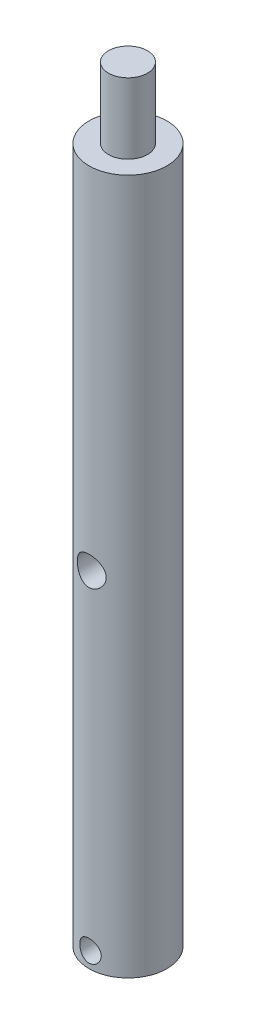
ISO-10303-21;
HEADER;
FILE_DESCRIPTION(('STEP AP214'),'2;1');
FILE_NAME('part.step','',(''),(''),'','','');
FILE_SCHEMA(('AUTOMOTIVE_DESIGN { 1 0 10303 214 1 1 1 1 }'));
ENDSEC;
DATA;
#1=APPLICATION_CONTEXT('core data for automotive mechanical design processes');
#2=APPLICATION_PROTOCOL_DEFINITION('international standard','automotive_design',2000,#1);
#3=PRODUCT_CONTEXT('',#1,'mechanical');
#4=PRODUCT('Part','Part','',(#3));
#5=PRODUCT_RELATED_PRODUCT_CATEGORY('part','',(#4));
#6=PRODUCT_DEFINITION_FORMATION('','',#4);
#7=PRODUCT_DEFINITION_CONTEXT('part definition',#1,'design');
#8=PRODUCT_DEFINITION('design','',#6,#7);
#9=PRODUCT_DEFINITION_SHAPE('','',#8);
#10=(LENGTH_UNIT() NAMED_UNIT(*) SI_UNIT(.MILLI.,.METRE.));
#11=(NAMED_UNIT(*) PLANE_ANGLE_UNIT() SI_UNIT($,.RADIAN.));
#12=(NAMED_UNIT(*) SI_UNIT($,.STERADIAN.) SOLID_ANGLE_UNIT());
#13=UNCERTAINTY_MEASURE_WITH_UNIT(LENGTH_MEASURE(1.E-05),#10,'distance_accuracy_value','');
#14=(GEOMETRIC_REPRESENTATION_CONTEXT(3) GLOBAL_UNCERTAINTY_ASSIGNED_CONTEXT((#13)) GLOBAL_UNIT_ASSIGNED_CONTEXT((#10,
#11,#12)) REPRESENTATION_CONTEXT('',''));
#15=CARTESIAN_POINT('',(0.,0.,0.));
#16=DIRECTION('',(0.,0.,1.));
#17=DIRECTION('',(1.,0.,0.));
#18=AXIS2_PLACEMENT_3D('',#15,#16,#17);
#19=CARTESIAN_POINT('',(0.,62.3951,0.));
#20=DIRECTION('',(0.,-1.,0.));
#21=DIRECTION('',(0.,0.,-1.));
#22=AXIS2_PLACEMENT_3D('',#19,#20,#21);
#23=CYLINDRICAL_SURFACE('',#22,6.35);
#24=CARTESIAN_POINT('',(0.,-3.89889999999999,-6.35));
#25=CARTESIAN_POINT('',(-0.127360787663598,-3.89889601703984,-6.35000295417938));
#26=CARTESIAN_POINT('',(-0.254693941260526,-3.90928844752814,-6.34613472077242));
#27=CARTESIAN_POINT('',(-0.505561435740975,-3.95042057182543,-6.33108941400565));
#28=CARTESIAN_POINT('',(-0.629096210144684,-3.9811579345192,-6.31991317799599));
#29=CARTESIAN_POINT('',(-0.868713197022827,-4.06174848789353,-6.29145339974386));
#30=CARTESIAN_POINT('',(-0.9848090651335,-4.11156540800036,-6.27418145042084));
#31=CARTESIAN_POINT('',(-1.20698916570876,-4.22871904163339,-6.2352558081497));
#32=CARTESIAN_POINT('',(-1.31307078013658,-4.29606031938014,-6.21360097400585));
#33=CARTESIAN_POINT('',(-1.51661477098559,-4.44927295080525,-6.16714597528546));
#34=CARTESIAN_POINT('',(-1.61360606143278,-4.53574341515809,-6.14225843360142));
#35=CARTESIAN_POINT('',(-1.79208769058705,-4.72348788728222,-6.09257912470365));
#36=CARTESIAN_POINT('',(-1.87357346545142,-4.8247662380947,-6.06778738778585));
#37=CARTESIAN_POINT('',(-2.02168724999719,-5.04380864433671,-6.02009716514052));
#38=CARTESIAN_POINT('',(-2.08765652139002,-5.16204291977699,-5.99730221410429));
#39=CARTESIAN_POINT('',(-2.19856499710894,-5.40890503293765,-5.95754220542621));
#40=CARTESIAN_POINT('',(-2.24351234810763,-5.53752882168687,-5.94057489006574));
#41=CARTESIAN_POINT('',(-2.30925278788329,-5.7961027739158,-5.91532366779428));
#42=CARTESIAN_POINT('',(-2.33094307399739,-5.92579241850637,-5.90671852366877));
#43=CARTESIAN_POINT('',(-2.35235907148794,-6.18723417693477,-5.89822455130618));
#44=CARTESIAN_POINT('',(-2.3520935482168,-6.3189854467131,-5.89833224466856));
#45=CARTESIAN_POINT('',(-2.33029282375646,-6.57267523647395,-5.90697422527143));
#46=CARTESIAN_POINT('',(-2.30999246723068,-6.69473960499904,-5.91501928491782));
#47=CARTESIAN_POINT('',(-2.2507363392273,-6.93358757347164,-5.93781804591648));
#48=CARTESIAN_POINT('',(-2.21177783389193,-7.05037039680324,-5.95257273037065));
#49=CARTESIAN_POINT('',(-2.11561737832595,-7.27789270210022,-5.98742940434679));
#50=CARTESIAN_POINT('',(-2.05808957635087,-7.38847937464579,-6.00762574971351));
#51=CARTESIAN_POINT('',(-1.92665049793876,-7.59879197586857,-6.05105769974177));
#52=CARTESIAN_POINT('',(-1.85273367192697,-7.69851420858088,-6.07429433279627));
#53=CARTESIAN_POINT('',(-1.68493032608606,-7.89111605256868,-6.12303988290107));
#54=CARTESIAN_POINT('',(-1.59005508572321,-7.98312383265699,-6.14859810531069));
#55=CARTESIAN_POINT('',(-1.38592433613824,-8.1501782615336,-6.19780001224358));
#56=CARTESIAN_POINT('',(-1.27666673601941,-8.22522243984757,-6.22144341758337));
#57=CARTESIAN_POINT('',(-1.04469636813253,-8.35714702327136,-6.26459981895838));
#58=CARTESIAN_POINT('',(-0.921809444786996,-8.41374425614779,-6.28404700108022));
#59=CARTESIAN_POINT('',(-0.667360573641363,-8.50517510779832,-6.31613310426047));
#60=CARTESIAN_POINT('',(-0.535802399742019,-8.54001812619151,-6.3287749654543));
#61=CARTESIAN_POINT('',(-0.27508842804644,-8.58529205082297,-6.34531292709005));
#62=CARTESIAN_POINT('',(-0.146163048250318,-8.59689744905127,-6.34962936529853));
#63=CARTESIAN_POINT('',(0.111849905262775,-8.59877726855824,-6.35032428081513));
#64=CARTESIAN_POINT('',(0.24093743819339,-8.58905627105882,-6.3467044629473));
#65=CARTESIAN_POINT('',(0.490582282231385,-8.54945698968406,-6.33221109212088));
#66=CARTESIAN_POINT('',(0.611278281932677,-8.5203419929561,-6.32161238151576));
#67=CARTESIAN_POINT('',(0.845992162467297,-8.44377978341044,-6.29450282311486));
#68=CARTESIAN_POINT('',(0.960009172099153,-8.39633018514847,-6.2779912060341));
#69=CARTESIAN_POINT('',(1.18184134520267,-8.28294400029316,-6.2400952028137));
#70=CARTESIAN_POINT('',(1.28937976088916,-8.21650996214139,-6.21858308562928));
#71=CARTESIAN_POINT('',(1.49213823360542,-8.06760553231921,-6.1730736905879));
#72=CARTESIAN_POINT('',(1.58735380909957,-7.98512933362177,-6.1490755142887));
#73=CARTESIAN_POINT('',(1.76838271101855,-7.80099934466734,-6.09955950207343));
#74=CARTESIAN_POINT('',(1.8533618340029,-7.6985257824198,-6.07403235592693));
#75=CARTESIAN_POINT('',(2.00507499925186,-7.48026344268712,-6.0256562849972));
#76=CARTESIAN_POINT('',(2.0718076306718,-7.36447363655387,-6.00280756739185));
#77=CARTESIAN_POINT('',(2.18514302312719,-7.1220429893022,-5.96249106238621));
#78=CARTESIAN_POINT('',(2.23168037366417,-6.99536845736189,-5.94504081170687));
#79=CARTESIAN_POINT('',(2.30246994587984,-6.73515837937945,-5.91798919101977));
#80=CARTESIAN_POINT('',(2.32673545884374,-6.60162697566195,-5.90838314016448));
#81=CARTESIAN_POINT('',(2.35112204023037,-6.34050565844945,-5.89871856501635));
#82=CARTESIAN_POINT('',(2.35266074729382,-6.21306774292601,-5.89809950047377));
#83=CARTESIAN_POINT('',(2.3351641751857,-5.95985188274213,-5.90504827867757));
#84=CARTESIAN_POINT('',(2.31613074185206,-5.83407379017873,-5.91261538691861));
#85=CARTESIAN_POINT('',(2.25912250259281,-5.59143195327047,-5.93462310046297));
#86=CARTESIAN_POINT('',(2.22171132439475,-5.4744156087386,-5.94885862296769));
#87=CARTESIAN_POINT('',(2.12950043137272,-5.24824875353715,-5.98248481595111));
#88=CARTESIAN_POINT('',(2.0746963773417,-5.13910021408985,-6.00187677267067));
#89=CARTESIAN_POINT('',(1.94598392572873,-4.92566977861112,-6.04487133798742));
#90=CARTESIAN_POINT('',(1.87123831892642,-4.82192643721682,-6.06863914725568));
#91=CARTESIAN_POINT('',(1.70607508258558,-4.62800142346976,-6.11712421917554));
#92=CARTESIAN_POINT('',(1.61565253996359,-4.53782401921956,-6.14184177757847));
#93=CARTESIAN_POINT('',(1.41606630307115,-4.36880538330508,-6.19098863347117));
#94=CARTESIAN_POINT('',(1.30617150973204,-4.29079983155387,-6.21533577935108));
#95=CARTESIAN_POINT('',(1.07398179449799,-4.15439909624378,-6.25963397000797));
#96=CARTESIAN_POINT('',(0.951686462040025,-4.0960045622521,-6.27958486916247));
#97=CARTESIAN_POINT('',(0.693940407512734,-3.99937166649362,-6.31334676608802));
#98=CARTESIAN_POINT('',(0.558193201156075,-3.96184143836239,-6.32693982045106));
#99=CARTESIAN_POINT('',(0.281617801168145,-3.9116136144786,-6.34526273164004));
#100=CARTESIAN_POINT('',(0.140792015649353,-3.8989044029956,-6.34999673427844));
#101=CARTESIAN_POINT('',(0.,-3.89889999999999,-6.35));
#102=B_SPLINE_CURVE_WITH_KNOTS('',3,(#24,#25,#26,#27,#28,#29,#30,#31,#32,#33,#34,#35,#36,#37,
#38,#39,#40,#41,#42,#43,#44,#45,#46,#47,#48,#49,#50,#51,#52,#53,#54,#55,#56,#57,#58,#59,#60,#61,
#62,#63,#64,#65,#66,#67,#68,#69,#70,#71,#72,#73,#74,#75,#76,#77,#78,#79,#80,#81,#82,#83,#84,#85,
#86,#87,#88,#89,#90,#91,#92,#93,#94,#95,#96,#97,#98,#99,#100,#101),.UNSPECIFIED.,.T.,.F.,(4,2,2,
2,2,2,2,2,2,2,2,2,2,2,2,2,2,2,2,2,2,2,2,2,2,2,2,2,2,2,2,2,2,2,2,2,2,2,4),(0.,0.381563194853741,
0.763082677896513,1.14388045704999,1.52477751445499,1.91992803023799,2.31519467403099,
2.72503784820589,3.13472206305114,3.52796025133525,3.92104144906659,4.29131821427317,
4.661649250344,5.03886848236164,5.4162156421982,5.8181994577924,6.22024177816762,
6.62819310361556,7.03596803815578,7.42255284392505,7.80905461375194,8.18117881780923,
8.55335145382225,8.93634629078968,9.31948002515868,9.72424227272188,10.1290358082327,
10.5351308179996,10.9409833223737,11.3214047080911,11.7017919632843,12.071179855639,
12.4406599761129,12.8291323644357,13.2177267191143,13.6265722162474,14.0354312540565,
14.4574309169944,14.8792330453147),.UNSPECIFIED.);
#103=CARTESIAN_POINT('',(0.,-3.89889999999999,-6.35));
#104=VERTEX_POINT('',#103);
#105=EDGE_CURVE('E11',#104,#104,#102,.T.);
#106=ORIENTED_EDGE('',*,*,#105,.T.);
#107=EDGE_LOOP('',(#106));
#108=FACE_BOUND('',#107,.T.);
#109=CARTESIAN_POINT('',(2.3495,-6.24839999999999,5.89935163810397));
#110=CARTESIAN_POINT('',(2.34950416257754,-6.37542276777419,5.89934781594907));
#111=CARTESIAN_POINT('',(2.33916467712139,-6.50241766708323,5.90349873527684));
#112=CARTESIAN_POINT('',(2.29826208385081,-6.75258681499724,5.91954118839437));
#113=CARTESIAN_POINT('',(2.26769914903923,-6.87576109627652,5.93143265596708));
#114=CARTESIAN_POINT('',(2.18761771928861,-7.11460933611899,5.96142871997765));
#115=CARTESIAN_POINT('',(2.13814356814877,-7.2303001058753,5.97951877151895));
#116=CARTESIAN_POINT('',(2.02180058281286,-7.45178378111252,6.01985057265957));
#117=CARTESIAN_POINT('',(1.95492667527511,-7.55757378752112,6.04209353260991));
#118=CARTESIAN_POINT('',(1.80221856774786,-7.7613691116358,6.08943028697059));
#119=CARTESIAN_POINT('',(1.71568001248059,-7.85882765515619,6.11460642634546));
#120=CARTESIAN_POINT('',(1.52759467394665,-8.03823267458698,6.16428478193693));
#121=CARTESIAN_POINT('',(1.42604480466711,-8.12017595296326,6.18878685834884));
#122=CARTESIAN_POINT('',(1.2066882642869,-8.26883877122084,6.23533196306354));
#123=CARTESIAN_POINT('',(1.088455692861,-8.33496666197606,6.25726715418425));
#124=CARTESIAN_POINT('',(0.841589634523237,-8.44616829754944,6.29521965359107));
#125=CARTESIAN_POINT('',(0.71295966922484,-8.49124913627367,6.31123895544585));
#126=CARTESIAN_POINT('',(0.454696659402946,-8.5571673418254,6.3349703565704));
#127=CARTESIAN_POINT('',(0.325333827907226,-8.57894545424901,6.34300379533128));
#128=CARTESIAN_POINT('',(0.0645568413114432,-8.60065138887064,6.35100996230542));
#129=CARTESIAN_POINT('',(-0.0668566511836316,-8.60058612862411,6.35098524244879));
#130=CARTESIAN_POINT('',(-0.321272286320008,-8.57916118040761,6.3430839684881));
#131=CARTESIAN_POINT('',(-0.444374623859201,-8.55882767041291,6.33558579561769));
#132=CARTESIAN_POINT('',(-0.685277549343277,-8.4991659198924,6.3140737243161));
#133=CARTESIAN_POINT('',(-0.803077762448842,-8.45983633871771,6.30005936600735));
#134=CARTESIAN_POINT('',(-1.03204632106991,-8.36280738518391,6.26665550738661));
#135=CARTESIAN_POINT('',(-1.14309457816074,-8.3048513638951,6.24719143048666));
#136=CARTESIAN_POINT('',(-1.3541623245565,-8.17243968231202,6.20486494482001));
#137=CARTESIAN_POINT('',(-1.45417829379381,-8.09797877848692,6.18200145683658));
#138=CARTESIAN_POINT('',(-1.64639632302541,-7.92969760523981,6.13369860479989));
#139=CARTESIAN_POINT('',(-1.73782605130817,-7.83501465275864,6.10818670268585));
#140=CARTESIAN_POINT('',(-1.90379552706816,-7.6314980070591,6.05851343702266));
#141=CARTESIAN_POINT('',(-1.97833126102718,-7.52266096088743,6.03435239542327));
#142=CARTESIAN_POINT('',(-2.10981903276059,-7.29095485007474,5.98966648486114));
#143=CARTESIAN_POINT('',(-2.16636673206277,-7.16783810215761,5.96922912696983));
#144=CARTESIAN_POINT('',(-2.2576383158245,-6.9128748878308,5.93531535420688));
#145=CARTESIAN_POINT('',(-2.29237395805142,-6.78103316705186,5.92183518976632));
#146=CARTESIAN_POINT('',(-2.33730198533951,-6.5199778564424,5.90424201185818));
#147=CARTESIAN_POINT('',(-2.34871779092261,-6.39100644842857,5.8996627186795));
#148=CARTESIAN_POINT('',(-2.35020380869722,-6.13293770463309,5.89907178117821));
#149=CARTESIAN_POINT('',(-2.34027915432657,-6.00384040660106,5.90305807640711));
#150=CARTESIAN_POINT('',(-2.30047415215067,-5.75536683953954,5.9186766440713));
#151=CARTESIAN_POINT('',(-2.27152700470306,-5.63581598754967,5.92995097894564));
#152=CARTESIAN_POINT('',(-2.1956659552013,-5.40331873467238,5.95845459424041));
#153=CARTESIAN_POINT('',(-2.14874843150414,-5.29037367036858,5.97568507495883));
#154=CARTESIAN_POINT('',(-2.03633165145481,-5.06967037853859,6.01494077524221));
#155=CARTESIAN_POINT('',(-1.97021171567841,-4.96225634662584,6.03711920238469));
#156=CARTESIAN_POINT('',(-1.8219325629784,-4.75961252316655,6.08350956693113));
#157=CARTESIAN_POINT('',(-1.739767611596,-4.66438710801196,6.10772222959909));
#158=CARTESIAN_POINT('',(-1.55575676657676,-4.48275939060073,6.15725022211408));
#159=CARTESIAN_POINT('',(-1.45301205299694,-4.39725818437393,6.18254194204652));
#160=CARTESIAN_POINT('',(-1.23401129407059,-4.24460906232498,6.22994795855869));
#161=CARTESIAN_POINT('',(-1.11775528789373,-4.17746109329811,6.25206226434943));
#162=CARTESIAN_POINT('',(-0.875183877068767,-4.06389594060374,6.29059271243923));
#163=CARTESIAN_POINT('',(-0.748910331610328,-4.01739734654965,6.30703117369958));
#164=CARTESIAN_POINT('',(-0.489589105449137,-3.94655364184917,6.33243555474542));
#165=CARTESIAN_POINT('',(-0.356544542660226,-3.92219843037366,6.34140488146168));
#166=CARTESIAN_POINT('',(-0.0956139015782402,-3.89740029778027,6.35054569750106));
#167=CARTESIAN_POINT('',(0.0321349586936934,-3.89567564250522,6.35118873631721));
#168=CARTESIAN_POINT('',(0.286022724009189,-3.9129075653673,6.3448254291786));
#169=CARTESIAN_POINT('',(0.412161812917924,-3.9318617598233,6.33781996487788));
#170=CARTESIAN_POINT('',(0.656277896496853,-3.98901802566729,6.31715707694262));
#171=CARTESIAN_POINT('',(0.774376458713085,-4.02676247014606,6.30365805244255));
#172=CARTESIAN_POINT('',(1.00257906977296,-4.11997660464972,6.27141367922318));
#173=CARTESIAN_POINT('',(1.1126816027644,-4.17544964487512,6.2526673389936));
#174=CARTESIAN_POINT('',(1.32677016204052,-4.30517031463905,6.21084321796331));
#175=CARTESIAN_POINT('',(1.43031253276918,-4.38010173363699,6.18761793252949));
#176=CARTESIAN_POINT('',(1.62375276244028,-4.54552392444178,6.13969666495256));
#177=CARTESIAN_POINT('',(1.71364578413146,-4.63602018822116,6.11500016571682));
#178=CARTESIAN_POINT('',(1.88195150015083,-4.83549923402074,6.0653816121456));
#179=CARTESIAN_POINT('',(1.9595440071435,-4.94518984140643,6.04051238773776));
#180=CARTESIAN_POINT('',(2.09521505777863,-5.17684071184823,5.99480767154747));
#181=CARTESIAN_POINT('',(2.15329256115075,-5.29880162853754,5.97397239482445));
#182=CARTESIAN_POINT('',(2.24944877495735,-5.55589974612953,5.93845276836343));
#183=CARTESIAN_POINT('',(2.28681665273962,-5.6913362506825,5.92399018185569));
#184=CARTESIAN_POINT('',(2.33683240463554,-5.96732866126508,5.90444459863118));
#185=CARTESIAN_POINT('',(2.34949539515908,-6.10788138311631,5.8993558663532));
#186=CARTESIAN_POINT('',(2.3495,-6.24839999999999,5.89935163810397));
#187=B_SPLINE_CURVE_WITH_KNOTS('',3,(#109,#110,#111,#112,#113,#114,#115,#116,#117,#118,#119,
#120,#121,#122,#123,#124,#125,#126,#127,#128,#129,#130,#131,#132,#133,#134,#135,#136,#137,#138,
#139,#140,#141,#142,#143,#144,#145,#146,#147,#148,#149,#150,#151,#152,#153,#154,#155,#156,#157,
#158,#159,#160,#161,#162,#163,#164,#165,#166,#167,#168,#169,#170,#171,#172,#173,#174,#175,#176,
#177,#178,#179,#180,#181,#182,#183,#184,#185,#186),.UNSPECIFIED.,.T.,.F.,(4,2,2,2,2,2,2,2,2,2,2,
2,2,2,2,2,2,2,2,2,2,2,2,2,2,2,2,2,2,2,2,2,2,2,2,2,2,2,4),(0.,0.380545404753957,
0.761087554148894,1.14074281276406,1.52050889382443,1.91697220404571,2.31351713249192,
2.72314861105262,3.13264192352631,3.52489562444744,3.91702510306134,4.29026066120437,
4.66352256431937,5.04216548758587,5.42092887694843,5.8213209244385,6.22180799388115,
6.63074801487038,7.03946740749357,7.42612826259023,7.81269611700133,8.18158860003149,
8.55055546661487,8.93311029579436,9.31580210042262,9.72199791288054,10.1281925477934,
10.532771221699,10.9371652520278,11.3185496921965,11.6998901742697,12.0723669937959,
12.444914242511,12.8329269989269,13.2210769455005,13.6290390569186,14.037022911791,
14.4582581332803,14.879235528707),.UNSPECIFIED.);
#188=CARTESIAN_POINT('',(2.3495,-6.24839999999999,5.89935163810397));
#189=VERTEX_POINT('',#188);
#190=EDGE_CURVE('E46',#189,#189,#187,.T.);
#191=ORIENTED_EDGE('',*,*,#190,.T.);
#192=EDGE_LOOP('',(#191));
#193=FACE_BOUND('',#192,.T.);
#194=CARTESIAN_POINT('',(0.,-58.1025,-6.35));
#195=CARTESIAN_POINT('',(-0.0964894226157657,-58.1025020180769,-6.34999868097296));
#196=CARTESIAN_POINT('',(-0.193000011158885,-58.1104949866302,-6.34777925764148));
#197=CARTESIAN_POINT('',(-0.383232761873479,-58.1421939377906,-6.33914140122541));
#198=CARTESIAN_POINT('',(-0.476953702630288,-58.1659067003831,-6.3327211563318));
#199=CARTESIAN_POINT('',(-0.658834357157783,-58.2282093836791,-6.31638891048172));
#200=CARTESIAN_POINT('',(-0.747001340789447,-58.266779365514,-6.30648159082313));
#201=CARTESIAN_POINT('',(-0.915615815814318,-58.357625561695,-6.28421752371453));
#202=CARTESIAN_POINT('',(-0.996062648429351,-58.409902944307,-6.27186056750676));
#203=CARTESIAN_POINT('',(-1.14893934684489,-58.5280420231818,-6.24568590336419));
#204=CARTESIAN_POINT('',(-1.2211514949012,-58.5941796178462,-6.2318418493727));
#205=CARTESIAN_POINT('',(-1.35361303925781,-58.7375724356679,-6.20441914811811));
#206=CARTESIAN_POINT('',(-1.4138607764611,-58.8148291981546,-6.19084053789897));
#207=CARTESIAN_POINT('',(-1.52176720011733,-58.9800330764128,-6.16521424481858));
#208=CARTESIAN_POINT('',(-1.56917133537008,-59.0681520685469,-6.15319967329906));
#209=CARTESIAN_POINT('',(-1.64840379284733,-59.2514950427405,-6.1324509120701));
#210=CARTESIAN_POINT('',(-1.68023521595149,-59.3467176059625,-6.12371606937297));
#211=CARTESIAN_POINT('',(-1.72665472639431,-59.5391439931272,-6.11078845614853));
#212=CARTESIAN_POINT('',(-1.74163939728588,-59.6362449685102,-6.10649142425342));
#213=CARTESIAN_POINT('',(-1.75517703654539,-59.8316703441902,-6.10261480128029));
#214=CARTESIAN_POINT('',(-1.75373331375979,-59.9299944941424,-6.10303426025259));
#215=CARTESIAN_POINT('',(-1.73476908546392,-60.1219458384586,-6.1084501520071));
#216=CARTESIAN_POINT('',(-1.71773288862844,-60.215625397056,-6.11330869709024));
#217=CARTESIAN_POINT('',(-1.6688448153941,-60.3987418966523,-6.12683392762812));
#218=CARTESIAN_POINT('',(-1.63699167994911,-60.4881784763989,-6.13550093669767));
#219=CARTESIAN_POINT('',(-1.55898966610975,-60.6615115701424,-6.1557847265027));
#220=CARTESIAN_POINT('',(-1.51267446231973,-60.7453290859093,-6.16743552743953));
#221=CARTESIAN_POINT('',(-1.40717892404888,-60.9041705927825,-6.19235638833388));
#222=CARTESIAN_POINT('',(-1.34799589578867,-60.9791927375767,-6.2056267870861));
#223=CARTESIAN_POINT('',(-1.21598744002771,-61.1210757742887,-6.23286163196998));
#224=CARTESIAN_POINT('',(-1.14275655053225,-61.1875584460089,-6.24683410168454));
#225=CARTESIAN_POINT('',(-0.98601306322713,-61.3073797771543,-6.27348298423051));
#226=CARTESIAN_POINT('',(-0.902500001261408,-61.3607178428816,-6.28615933850559));
#227=CARTESIAN_POINT('',(-0.726949893124698,-61.452919008176,-6.30887512463733));
#228=CARTESIAN_POINT('',(-0.634872893288107,-61.4917095273092,-6.31890126264261));
#229=CARTESIAN_POINT('',(-0.445163642641264,-61.553149094447,-6.33509103581743));
#230=CARTESIAN_POINT('',(-0.347532701044749,-61.5758019296522,-6.34125557718761));
#231=CARTESIAN_POINT('',(-0.152711354665405,-61.6037196611219,-6.34888883007251));
#232=CARTESIAN_POINT('',(-0.0555998939294249,-61.6094983178975,-6.35049624462336));
#233=CARTESIAN_POINT('',(0.138206043912648,-61.6049281679988,-6.34923509996126));
#234=CARTESIAN_POINT('',(0.234900566235057,-61.5945811566077,-6.34636703900643));
#235=CARTESIAN_POINT('',(0.423265780748084,-61.5584733579929,-6.33656715816778));
#236=CARTESIAN_POINT('',(0.514996459801714,-61.5330028030274,-6.3297119049187));
#237=CARTESIAN_POINT('',(0.692871290209106,-61.4677112205172,-6.31271885429096));
#238=CARTESIAN_POINT('',(0.779014814055137,-61.4278885843353,-6.30258068896367));
#239=CARTESIAN_POINT('',(0.94523802172342,-61.3340949957555,-6.279825891838));
#240=CARTESIAN_POINT('',(1.02515617250917,-61.279849406428,-6.2671624925579));
#241=CARTESIAN_POINT('',(1.17493442006609,-61.1590917733208,-6.24081901485448));
#242=CARTESIAN_POINT('',(1.24479237855934,-61.092577128605,-6.22713872122596));
#243=CARTESIAN_POINT('',(1.37465917949332,-60.9467662673252,-6.19978680186562));
#244=CARTESIAN_POINT('',(1.43430452984001,-60.8671432593975,-6.18612805375406));
#245=CARTESIAN_POINT('',(1.53939979297545,-60.6987263342053,-6.16081823281727));
#246=CARTESIAN_POINT('',(1.58485025802439,-60.6099327739053,-6.14916708189321));
#247=CARTESIAN_POINT('',(1.65992659474235,-60.4261067966892,-6.12932725215034));
#248=CARTESIAN_POINT('',(1.68964102764205,-60.331112749301,-6.1211192510847));
#249=CARTESIAN_POINT('',(1.73259204907449,-60.1372084890332,-6.10910236642375));
#250=CARTESIAN_POINT('',(1.74583321944865,-60.0382993729841,-6.1052922596279));
#251=CARTESIAN_POINT('',(1.75518478622932,-59.8431081266891,-6.10260981826675));
#252=CARTESIAN_POINT('',(1.75188149953653,-59.7468560039704,-6.10356847570969));
#253=CARTESIAN_POINT('',(1.7296086103864,-59.5563382779385,-6.10991696679872));
#254=CARTESIAN_POINT('',(1.7106394670333,-59.462072616493,-6.11530667058837));
#255=CARTESIAN_POINT('',(1.65792418638248,-59.279000656883,-6.12980578842125));
#256=CARTESIAN_POINT('',(1.62431063106394,-59.1901533462838,-6.13888178014392));
#257=CARTESIAN_POINT('',(1.54336327335063,-59.0192904854721,-6.15972960653022));
#258=CARTESIAN_POINT('',(1.49602718203959,-58.9372760779268,-6.1715018908661));
#259=CARTESIAN_POINT('',(1.38723686998117,-58.7796291200093,-6.19687677552227));
#260=CARTESIAN_POINT('',(1.32538656709768,-58.7042772482772,-6.21052518635455));
#261=CARTESIAN_POINT('',(1.19006589832005,-58.5648316155041,-6.23786823971093));
#262=CARTESIAN_POINT('',(1.11659266505009,-58.5007406407821,-6.25156289282497));
#263=CARTESIAN_POINT('',(0.95803708781904,-58.3841552082791,-6.27783910550378));
#264=CARTESIAN_POINT('',(0.87272324066849,-58.3319673473722,-6.29038710264316));
#265=CARTESIAN_POINT('',(0.694187795848468,-58.2427555188051,-6.31258039861988));
#266=CARTESIAN_POINT('',(0.600970953843276,-58.2057225087359,-6.32222742745719));
#267=CARTESIAN_POINT('',(0.423513867640852,-58.1523028399381,-6.33639133903246));
#268=CARTESIAN_POINT('',(0.339986296539799,-58.1336720108138,-6.34145610005431));
#269=CARTESIAN_POINT('',(0.170977872868171,-58.1087704056741,-6.34826082422403));
#270=CARTESIAN_POINT('',(0.0854972454987045,-58.1024982118246,-6.35000116876208));
#271=CARTESIAN_POINT('',(0.,-58.1025,-6.35));
#272=B_SPLINE_CURVE_WITH_KNOTS('',3,(#194,#195,#196,#197,#198,#199,#200,#201,#202,#203,#204,
#205,#206,#207,#208,#209,#210,#211,#212,#213,#214,#215,#216,#217,#218,#219,#220,#221,#222,#223,
#224,#225,#226,#227,#228,#229,#230,#231,#232,#233,#234,#235,#236,#237,#238,#239,#240,#241,#242,
#243,#244,#245,#246,#247,#248,#249,#250,#251,#252,#253,#254,#255,#256,#257,#258,#259,#260,#261,
#262,#263,#264,#265,#266,#267,#268,#269,#270,#271),.UNSPECIFIED.,.T.,.F.,(4,2,2,2,2,2,2,2,2,2,2,
2,2,2,2,2,2,2,2,2,2,2,2,2,2,2,2,2,2,2,2,2,2,2,2,2,2,2,4),(0.,0.289154592243518,
0.578433978774893,0.867326488016319,1.15624362723788,1.45157706192702,1.74695142175653,
2.04781081178596,2.34861026948914,2.64216989644826,2.93567039854368,3.22035306870248,
3.50505993374503,3.79316988672875,4.08134021147119,4.37961097893001,4.67789521581656,
4.97764845240921,5.27733131955059,5.567789550107,5.85821544603292,6.14324022223845,
6.42829695507158,6.71922769696934,7.01022018475574,7.31004891397295,7.60986597672714,
7.9079772605273,8.20600560967982,8.49354851248223,8.78108298883927,9.06606669937073,
9.3510979725059,9.64506502088839,9.93910470433705,10.2400278317457,10.5407711453468,
10.7970143394926,11.0532281346416),.UNSPECIFIED.);
#273=CARTESIAN_POINT('',(0.,-58.1025,-6.35));
#274=VERTEX_POINT('',#273);
#275=EDGE_CURVE('E60',#274,#274,#272,.T.);
#276=ORIENTED_EDGE('',*,*,#275,.T.);
#277=EDGE_LOOP('',(#276));
#278=FACE_BOUND('',#277,.T.);
#279=CARTESIAN_POINT('',(1.7526,-59.8551,6.10335098450023));
#280=CARTESIAN_POINT('',(1.75259794626496,-59.951510455337,6.10335251695922));
#281=CARTESIAN_POINT('',(1.74461760054116,-60.0479421402912,6.10566036264562));
#282=CARTESIAN_POINT('',(1.71297332491204,-60.2380113133837,6.11461234234238));
#283=CARTESIAN_POINT('',(1.68930225076225,-60.3316475083849,6.12125845161385));
#284=CARTESIAN_POINT('',(1.62712136325294,-60.5133482745987,6.13807817150491));
#285=CARTESIAN_POINT('',(1.58863342796716,-60.6014208387249,6.14824657901064));
#286=CARTESIAN_POINT('',(1.49798087592041,-60.7698749381154,6.17095843344206));
#287=CARTESIAN_POINT('',(1.44581492260667,-60.8502557207259,6.18350211243501));
#288=CARTESIAN_POINT('',(1.32779227488156,-61.0031977551795,6.20992779057142));
#289=CARTESIAN_POINT('',(1.26163457143003,-61.0755224446698,6.22383484692864));
#290=CARTESIAN_POINT('',(1.11815316144012,-61.2082038106406,6.25120464583083));
#291=CARTESIAN_POINT('',(1.04082822822366,-61.2685591706049,6.26466733936437));
#292=CARTESIAN_POINT('',(0.875555521168269,-61.3765859914955,6.28991250160491));
#293=CARTESIAN_POINT('',(0.78744748716112,-61.4240206489536,6.30166197365534));
#294=CARTESIAN_POINT('',(0.604127744218483,-61.5033124563382,6.32186837179869));
#295=CARTESIAN_POINT('',(0.508917325572738,-61.5351724278118,6.33032589421237));
#296=CARTESIAN_POINT('',(0.316566329534245,-61.5816402266496,6.34281825227595));
#297=CARTESIAN_POINT('',(0.219529870855627,-61.5966508451434,6.34695617235424));
#298=CARTESIAN_POINT('',(0.0242336615380192,-61.6102628093583,6.35070421618892));
#299=CARTESIAN_POINT('',(-0.07402586720359,-61.6088670894977,6.35031514963695));
#300=CARTESIAN_POINT('',(-0.2661694747721,-61.5899860823448,6.34512787443605));
#301=CARTESIAN_POINT('',(-0.360100059406414,-61.5729362333514,6.34044899693799));
#302=CARTESIAN_POINT('',(-0.543711175275306,-61.5239365132102,6.32734975634662));
#303=CARTESIAN_POINT('',(-0.633391455557364,-61.4919857634666,6.31892917263397));
#304=CARTESIAN_POINT('',(-0.807047145137719,-61.4137681306727,6.29911891797084));
#305=CARTESIAN_POINT('',(-0.890953288375817,-61.3673553909844,6.2876991923771));
#306=CARTESIAN_POINT('',(-1.0499322753493,-61.2616440660195,6.26311604942307));
#307=CARTESIAN_POINT('',(-1.12500328766678,-61.2023428163341,6.24995227173937));
#308=CARTESIAN_POINT('',(-1.26678057213723,-61.0702401944532,6.22279304979688));
#309=CARTESIAN_POINT('',(-1.33313142070097,-60.9970596031125,6.20878448970876));
#310=CARTESIAN_POINT('',(-1.45270943454842,-60.8404668338202,6.18190115444861));
#311=CARTESIAN_POINT('',(-1.50593567728918,-60.7570539372456,6.16902645901804));
#312=CARTESIAN_POINT('',(-1.59805025001677,-60.581549832537,6.14581302921839));
#313=CARTESIAN_POINT('',(-1.6368354114183,-60.4894018663185,6.1354927125734));
#314=CARTESIAN_POINT('',(-1.69824356660838,-60.2995359394668,6.11878197981462));
#315=CARTESIAN_POINT('',(-1.72087089967401,-60.2018194819015,6.11239050865116));
#316=CARTESIAN_POINT('',(-1.74869464949338,-60.0069304533946,6.10448777581417));
#317=CARTESIAN_POINT('',(-1.75442398582805,-59.9098399338227,6.10282736769533));
#318=CARTESIAN_POINT('',(-1.74976280415056,-59.7160868115709,6.10416550282071));
#319=CARTESIAN_POINT('',(-1.73937414202815,-59.6194241609096,6.10716350967676));
#320=CARTESIAN_POINT('',(-1.70324305015451,-59.4313686420668,6.11733596454621));
#321=CARTESIAN_POINT('',(-1.6778270128124,-59.3399077841958,6.12442155359198));
#322=CARTESIAN_POINT('',(-1.61273267435427,-59.1625488713494,6.14188257416096));
#323=CARTESIAN_POINT('',(-1.57305241456892,-59.0766515822394,6.15225845746269));
#324=CARTESIAN_POINT('',(-1.47949346252441,-58.9106451803247,6.17543250627883));
#325=CARTESIAN_POINT('',(-1.42530515365754,-58.8307178306105,6.18828153061843));
#326=CARTESIAN_POINT('',(-1.30464768763381,-58.680895230983,6.21483733048254));
#327=CARTESIAN_POINT('',(-1.238176051575,-58.6110020111287,6.22854427877504));
#328=CARTESIAN_POINT('',(-1.0923627839418,-58.4809877944846,6.25578963503158));
#329=CARTESIAN_POINT('',(-1.01268406168451,-58.4212401379808,6.26930941193231));
#330=CARTESIAN_POINT('',(-0.844121421835073,-58.3159646658182,6.29422008416217));
#331=CARTESIAN_POINT('',(-0.755237993204923,-58.2704360953448,6.30561109248326));
#332=CARTESIAN_POINT('',(-0.571412866371438,-58.1953186264472,6.32490742967616));
#333=CARTESIAN_POINT('',(-0.47652320503526,-58.1656094492868,6.33283897561726));
#334=CARTESIAN_POINT('',(-0.282844776907256,-58.1226339012868,6.34443834543896));
#335=CARTESIAN_POINT('',(-0.184056946532447,-58.1093636060178,6.34810718693556));
#336=CARTESIAN_POINT('',(0.0111363984208209,-58.0999028099599,6.35071593681038));
#337=CARTESIAN_POINT('',(0.107513797940688,-58.1031664670588,6.34980697985309));
#338=CARTESIAN_POINT('',(0.298292954410072,-58.1254034664619,6.34370793446486));
#339=CARTESIAN_POINT('',(0.3926947949893,-58.1443761423842,6.33851802763327));
#340=CARTESIAN_POINT('',(0.57613713475528,-58.1971754269794,6.32447392046575));
#341=CARTESIAN_POINT('',(0.665213883077589,-58.2308843417005,6.31564878522658));
#342=CARTESIAN_POINT('',(0.83649755772883,-58.3120945119955,6.295253749995));
#343=CARTESIAN_POINT('',(0.918703467550517,-58.3595978037456,6.28368344483658));
#344=CARTESIAN_POINT('',(1.07642454113083,-58.4686066436277,6.25862373963338));
#345=CARTESIAN_POINT('',(1.15168594138802,-58.5304689899264,6.24508945460601));
#346=CARTESIAN_POINT('',(1.29094373216822,-58.6657725141366,6.21779786269504));
#347=CARTESIAN_POINT('',(1.35493708170785,-58.7392168076385,6.20404049669772));
#348=CARTESIAN_POINT('',(1.47137084994142,-58.8977210500189,6.17747741882724));
#349=CARTESIAN_POINT('',(1.52349678398539,-58.9830176665599,6.16470250993515));
#350=CARTESIAN_POINT('',(1.61259710888949,-59.1615060742185,6.14199953074298));
#351=CARTESIAN_POINT('',(1.64958073150154,-59.2546930129246,6.13206972699108));
#352=CARTESIAN_POINT('',(1.70290305309556,-59.4320332125994,6.11745570592439));
#353=CARTESIAN_POINT('',(1.72149371250894,-59.5154695885842,6.11221107488818));
#354=CARTESIAN_POINT('',(1.7463422704444,-59.6842985982682,6.10515826532017));
#355=CARTESIAN_POINT('',(1.75260181938277,-59.769690968626,6.10334962691057));
#356=CARTESIAN_POINT('',(1.7526,-59.8551,6.10335098450023));
#357=B_SPLINE_CURVE_WITH_KNOTS('',3,(#279,#280,#281,#282,#283,#284,#285,#286,#287,#288,#289,
#290,#291,#292,#293,#294,#295,#296,#297,#298,#299,#300,#301,#302,#303,#304,#305,#306,#307,#308,
#309,#310,#311,#312,#313,#314,#315,#316,#317,#318,#319,#320,#321,#322,#323,#324,#325,#326,#327,
#328,#329,#330,#331,#332,#333,#334,#335,#336,#337,#338,#339,#340,#341,#342,#343,#344,#345,#346,
#347,#348,#349,#350,#351,#352,#353,#354,#355,#356),.UNSPECIFIED.,.T.,.F.,(4,2,2,2,2,2,2,2,2,2,2,
2,2,2,2,2,2,2,2,2,2,2,2,2,2,2,2,2,2,2,2,2,2,2,2,2,2,2,4),(0.,0.28891704651496,0.577965732114386,
0.866589245168696,1.15524097169745,1.45088436733375,1.74656026301783,2.04733750337122,
2.34806023399645,2.64142986892116,2.93474703289648,3.220144588109,3.50555897323088,
3.79395054669055,4.08240179540467,4.38032066284911,4.678260465372,4.97828970039488,
5.27823833051932,5.56862049142403,5.85896921906582,6.1432319895672,6.42753380808394,
6.71846757528378,7.00946012016283,7.30954007407364,7.60960409564558,7.90735284596372,
8.20503050146601,8.49294613753347,8.78084956074944,9.06649443491644,9.35218149432892,
9.64591763935241,9.93973293579687,10.2406069134477,10.5412971843498,10.7972800895666,
11.0532287312782),.UNSPECIFIED.);
#358=CARTESIAN_POINT('',(1.7526,-59.8551,6.10335098450023));
#359=VERTEX_POINT('',#358);
#360=EDGE_CURVE('E80',#359,#359,#357,.T.);
#361=ORIENTED_EDGE('',*,*,#360,.T.);
#362=EDGE_LOOP('',(#361));
#363=FACE_BOUND('',#362,.T.);
#364=CARTESIAN_POINT('',(0.,-62.3951,0.));
#365=DIRECTION('',(0.,1.,0.));
#366=DIRECTION('',(0.,0.,1.));
#367=AXIS2_PLACEMENT_3D('',#364,#365,#366);
#368=CIRCLE('',#367,6.35);
#369=CARTESIAN_POINT('',(0.,-62.3951,6.35));
#370=VERTEX_POINT('',#369);
#371=EDGE_CURVE('E50',#370,#370,#368,.T.);
#372=ORIENTED_EDGE('',*,*,#371,.T.);
#373=EDGE_LOOP('',(#372));
#374=FACE_BOUND('',#373,.T.);
#375=CARTESIAN_POINT('',(0.,50.9016,0.));
#376=DIRECTION('',(0.,1.,0.));
#377=DIRECTION('',(0.,0.,1.));
#378=AXIS2_PLACEMENT_3D('',#375,#376,#377);
#379=CIRCLE('',#378,6.35);
#380=CARTESIAN_POINT('',(0.,50.9016,6.35));
#381=VERTEX_POINT('',#380);
#382=EDGE_CURVE('E54',#381,#381,#379,.T.);
#383=ORIENTED_EDGE('',*,*,#382,.F.);
#384=EDGE_LOOP('',(#383));
#385=FACE_BOUND('',#384,.T.);
#386=ADVANCED_FACE('F35',(#108,#193,#278,#363,#374,#385),#23,.T.);
#387=CARTESIAN_POINT('',(0.,-62.3951,0.));
#388=DIRECTION('',(0.,1.,0.));
#389=DIRECTION('',(0.,0.,1.));
#390=AXIS2_PLACEMENT_3D('',#387,#388,#389);
#391=PLANE('',#390);
#392=ORIENTED_EDGE('',*,*,#371,.F.);
#393=EDGE_LOOP('',(#392));
#394=FACE_BOUND('',#393,.T.);
#395=ADVANCED_FACE('F100',(#394),#391,.F.);
#396=CARTESIAN_POINT('',(0.,50.9016,0.));
#397=DIRECTION('',(0.,1.,0.));
#398=DIRECTION('',(0.,0.,1.));
#399=AXIS2_PLACEMENT_3D('',#396,#397,#398);
#400=PLANE('',#399);
#401=CARTESIAN_POINT('',(0.,50.9016,0.));
#402=DIRECTION('',(0.,1.,0.));
#403=DIRECTION('',(0.,0.,1.));
#404=AXIS2_PLACEMENT_3D('',#401,#402,#403);
#405=CIRCLE('',#404,3.175);
#406=CARTESIAN_POINT('',(0.,50.9016,3.175));
#407=VERTEX_POINT('',#406);
#408=EDGE_CURVE('E87',#407,#407,#405,.T.);
#409=ORIENTED_EDGE('',*,*,#408,.F.);
#410=EDGE_LOOP('',(#409));
#411=FACE_BOUND('',#410,.T.);
#412=ORIENTED_EDGE('',*,*,#382,.T.);
#413=EDGE_LOOP('',(#412));
#414=FACE_BOUND('',#413,.T.);
#415=ADVANCED_FACE('F97',(#411,#414),#400,.T.);
#416=CARTESIAN_POINT('',(0.,50.9016,0.));
#417=DIRECTION('',(0.,1.,0.));
#418=DIRECTION('',(0.,0.,1.));
#419=AXIS2_PLACEMENT_3D('',#416,#417,#418);
#420=CYLINDRICAL_SURFACE('',#419,3.175);
#421=ORIENTED_EDGE('',*,*,#408,.T.);
#422=EDGE_LOOP('',(#421));
#423=FACE_BOUND('',#422,.T.);
#424=CARTESIAN_POINT('',(0.,62.3951,0.));
#425=DIRECTION('',(0.,1.,0.));
#426=DIRECTION('',(0.,0.,1.));
#427=AXIS2_PLACEMENT_3D('',#424,#425,#426);
#428=CIRCLE('',#427,3.175);
#429=CARTESIAN_POINT('',(0.,62.3951,3.175));
#430=VERTEX_POINT('',#429);
#431=EDGE_CURVE('E89',#430,#430,#428,.T.);
#432=ORIENTED_EDGE('',*,*,#431,.F.);
#433=EDGE_LOOP('',(#432));
#434=FACE_BOUND('',#433,.T.);
#435=ADVANCED_FACE('F77',(#423,#434),#420,.T.);
#436=CARTESIAN_POINT('',(0.,62.3951,0.));
#437=DIRECTION('',(0.,1.,0.));
#438=DIRECTION('',(0.,0.,1.));
#439=AXIS2_PLACEMENT_3D('',#436,#437,#438);
#440=PLANE('',#439);
#441=ORIENTED_EDGE('',*,*,#431,.T.);
#442=EDGE_LOOP('',(#441));
#443=FACE_BOUND('',#442,.T.);
#444=ADVANCED_FACE('F75',(#443),#440,.T.);
#445=CARTESIAN_POINT('',(0.,-59.8551,-9.525));
#446=DIRECTION('',(0.,0.,1.));
#447=DIRECTION('',(1.,0.,0.));
#448=AXIS2_PLACEMENT_3D('',#445,#446,#447);
#449=CYLINDRICAL_SURFACE('',#448,1.7526);
#450=ORIENTED_EDGE('',*,*,#360,.F.);
#451=EDGE_LOOP('',(#450));
#452=FACE_BOUND('',#451,.T.);
#453=ORIENTED_EDGE('',*,*,#275,.F.);
#454=EDGE_LOOP('',(#453));
#455=FACE_BOUND('',#454,.T.);
#456=ADVANCED_FACE('F69',(#452,#455),#449,.F.);
#457=CARTESIAN_POINT('',(0.,-6.24839999999999,-6.35));
#458=DIRECTION('',(0.,0.,1.));
#459=DIRECTION('',(1.,0.,0.));
#460=AXIS2_PLACEMENT_3D('',#457,#458,#459);
#461=CYLINDRICAL_SURFACE('',#460,2.3495);
#462=ORIENTED_EDGE('',*,*,#190,.F.);
#463=EDGE_LOOP('',(#462));
#464=FACE_BOUND('',#463,.T.);
#465=ORIENTED_EDGE('',*,*,#105,.F.);
#466=EDGE_LOOP('',(#465));
#467=FACE_BOUND('',#466,.T.);
#468=ADVANCED_FACE('F66',(#464,#467),#461,.F.);
#469=CLOSED_SHELL('',(#386,#395,#415,#435,#444,#456,#468));
#470=MANIFOLD_SOLID_BREP('B2',#469);
#471=ADVANCED_BREP_SHAPE_REPRESENTATION('',(#18,#470),#14);
#472=SHAPE_DEFINITION_REPRESENTATION(#9,#471);
ENDSEC;
END-ISO-10303-21;
